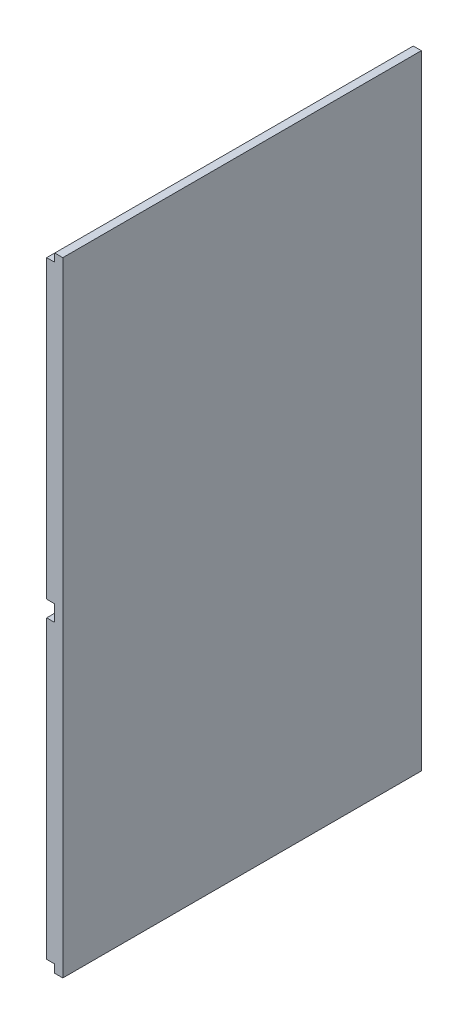
ISO-10303-21;
HEADER;
FILE_DESCRIPTION(('STEP AP214'),'2;1');
FILE_NAME('part.step','',(''),(''),'','','');
FILE_SCHEMA(('AUTOMOTIVE_DESIGN { 1 0 10303 214 1 1 1 1 }'));
ENDSEC;
DATA;
#1=APPLICATION_CONTEXT('core data for automotive mechanical design processes');
#2=APPLICATION_PROTOCOL_DEFINITION('international standard','automotive_design',2000,#1);
#3=PRODUCT_CONTEXT('',#1,'mechanical');
#4=PRODUCT('Part','Part','',(#3));
#5=PRODUCT_RELATED_PRODUCT_CATEGORY('part','',(#4));
#6=PRODUCT_DEFINITION_FORMATION('','',#4);
#7=PRODUCT_DEFINITION_CONTEXT('part definition',#1,'design');
#8=PRODUCT_DEFINITION('design','',#6,#7);
#9=PRODUCT_DEFINITION_SHAPE('','',#8);
#10=(LENGTH_UNIT() NAMED_UNIT(*) SI_UNIT(.MILLI.,.METRE.));
#11=(NAMED_UNIT(*) PLANE_ANGLE_UNIT() SI_UNIT($,.RADIAN.));
#12=(NAMED_UNIT(*) SI_UNIT($,.STERADIAN.) SOLID_ANGLE_UNIT());
#13=UNCERTAINTY_MEASURE_WITH_UNIT(LENGTH_MEASURE(1.E-05),#10,'distance_accuracy_value','');
#14=(GEOMETRIC_REPRESENTATION_CONTEXT(3) GLOBAL_UNCERTAINTY_ASSIGNED_CONTEXT((#13)) GLOBAL_UNIT_ASSIGNED_CONTEXT((#10,
#11,#12)) REPRESENTATION_CONTEXT('',''));
#15=CARTESIAN_POINT('',(0.,0.,0.));
#16=DIRECTION('',(0.,0.,1.));
#17=DIRECTION('',(1.,0.,0.));
#18=AXIS2_PLACEMENT_3D('',#15,#16,#17);
#19=CARTESIAN_POINT('',(0.,0.,0.));
#20=DIRECTION('',(-1.,0.,0.));
#21=DIRECTION('',(0.,0.,1.));
#22=AXIS2_PLACEMENT_3D('',#19,#20,#21);
#23=PLANE('',#22);
#24=DIRECTION('',(0.,0.,1.));
#25=VECTOR('',#24,1.);
#26=CARTESIAN_POINT('',(0.,-9.,-200.));
#27=LINE('',#26,#25);
#28=CARTESIAN_POINT('',(0.,-9.,-200.));
#29=VERTEX_POINT('',#28);
#30=CARTESIAN_POINT('',(0.,-9.,200.));
#31=VERTEX_POINT('',#30);
#32=EDGE_CURVE('E137',#29,#31,#27,.T.);
#33=ORIENTED_EDGE('',*,*,#32,.F.);
#34=DIRECTION('',(0.,1.,0.));
#35=VECTOR('',#34,1.);
#36=CARTESIAN_POINT('',(0.,-348.,-200.));
#37=LINE('',#36,#35);
#38=CARTESIAN_POINT('',(0.,-339.,-200.));
#39=VERTEX_POINT('',#38);
#40=EDGE_CURVE('E194',#39,#29,#37,.T.);
#41=ORIENTED_EDGE('',*,*,#40,.F.);
#42=DIRECTION('',(0.,0.,-1.));
#43=VECTOR('',#42,1.);
#44=CARTESIAN_POINT('',(0.,-339.,-200.));
#45=LINE('',#44,#43);
#46=CARTESIAN_POINT('',(0.,-339.,200.));
#47=VERTEX_POINT('',#46);
#48=EDGE_CURVE('E153',#47,#39,#45,.T.);
#49=ORIENTED_EDGE('',*,*,#48,.F.);
#50=DIRECTION('',(0.,-1.,0.));
#51=VECTOR('',#50,1.);
#52=CARTESIAN_POINT('',(0.,-348.,200.));
#53=LINE('',#52,#51);
#54=EDGE_CURVE('E56',#31,#47,#53,.T.);
#55=ORIENTED_EDGE('',*,*,#54,.F.);
#56=EDGE_LOOP('',(#33,#41,#49,#55));
#57=FACE_BOUND('',#56,.T.);
#58=ADVANCED_FACE('F33',(#57),#23,.T.);
#59=CARTESIAN_POINT('',(18.,-348.,-200.));
#60=DIRECTION('',(0.,0.,1.));
#61=DIRECTION('',(1.,0.,0.));
#62=AXIS2_PLACEMENT_3D('',#59,#60,#61);
#63=PLANE('',#62);
#64=ORIENTED_EDGE('',*,*,#40,.T.);
#65=DIRECTION('',(-1.,0.,0.));
#66=VECTOR('',#65,1.);
#67=CARTESIAN_POINT('',(9.,-9.,-200.));
#68=LINE('',#67,#66);
#69=CARTESIAN_POINT('',(9.,-9.,-200.));
#70=VERTEX_POINT('',#69);
#71=EDGE_CURVE('E145',#70,#29,#68,.T.);
#72=ORIENTED_EDGE('',*,*,#71,.F.);
#73=DIRECTION('',(0.,-1.,0.));
#74=VECTOR('',#73,1.);
#75=CARTESIAN_POINT('',(9.,-9.,-200.));
#76=LINE('',#75,#74);
#77=CARTESIAN_POINT('',(9.,9.,-200.));
#78=VERTEX_POINT('',#77);
#79=EDGE_CURVE('E129',#78,#70,#76,.T.);
#80=ORIENTED_EDGE('',*,*,#79,.F.);
#81=DIRECTION('',(-1.,0.,0.));
#82=VECTOR('',#81,1.);
#83=CARTESIAN_POINT('',(9.,9.,-200.));
#84=LINE('',#83,#82);
#85=CARTESIAN_POINT('',(0.,9.,-200.));
#86=VERTEX_POINT('',#85);
#87=EDGE_CURVE('E126',#78,#86,#84,.T.);
#88=ORIENTED_EDGE('',*,*,#87,.T.);
#89=CARTESIAN_POINT('',(0.,339.,-200.));
#90=VERTEX_POINT('',#89);
#91=EDGE_CURVE('E166',#86,#90,#37,.T.);
#92=ORIENTED_EDGE('',*,*,#91,.T.);
#93=DIRECTION('',(-1.,0.,0.));
#94=VECTOR('',#93,1.);
#95=CARTESIAN_POINT('',(9.,339.,-200.));
#96=LINE('',#95,#94);
#97=CARTESIAN_POINT('',(9.,339.,-200.));
#98=VERTEX_POINT('',#97);
#99=EDGE_CURVE('E178',#98,#90,#96,.T.);
#100=ORIENTED_EDGE('',*,*,#99,.F.);
#101=DIRECTION('',(0.,-1.,0.));
#102=VECTOR('',#101,1.);
#103=CARTESIAN_POINT('',(9.,348.,-200.));
#104=LINE('',#103,#102);
#105=CARTESIAN_POINT('',(9.,348.,-200.));
#106=VERTEX_POINT('',#105);
#107=EDGE_CURVE('E173',#106,#98,#104,.T.);
#108=ORIENTED_EDGE('',*,*,#107,.F.);
#109=DIRECTION('',(-1.,0.,0.));
#110=VECTOR('',#109,1.);
#111=CARTESIAN_POINT('',(18.,348.,-200.));
#112=LINE('',#111,#110);
#113=CARTESIAN_POINT('',(18.,348.,-200.));
#114=VERTEX_POINT('',#113);
#115=EDGE_CURVE('E11',#114,#106,#112,.T.);
#116=ORIENTED_EDGE('',*,*,#115,.F.);
#117=DIRECTION('',(0.,1.,0.));
#118=VECTOR('',#117,1.);
#119=CARTESIAN_POINT('',(18.,-348.,-200.));
#120=LINE('',#119,#118);
#121=CARTESIAN_POINT('',(18.,-348.,-200.));
#122=VERTEX_POINT('',#121);
#123=EDGE_CURVE('E184',#122,#114,#120,.T.);
#124=ORIENTED_EDGE('',*,*,#123,.F.);
#125=DIRECTION('',(-1.,0.,0.));
#126=VECTOR('',#125,1.);
#127=CARTESIAN_POINT('',(18.,-348.,-200.));
#128=LINE('',#127,#126);
#129=CARTESIAN_POINT('',(9.,-348.,-200.));
#130=VERTEX_POINT('',#129);
#131=EDGE_CURVE('E193',#122,#130,#128,.T.);
#132=ORIENTED_EDGE('',*,*,#131,.T.);
#133=DIRECTION('',(0.,-1.,0.));
#134=VECTOR('',#133,1.);
#135=CARTESIAN_POINT('',(9.,-348.,-200.));
#136=LINE('',#135,#134);
#137=CARTESIAN_POINT('',(9.,-339.,-200.));
#138=VERTEX_POINT('',#137);
#139=EDGE_CURVE('E150',#138,#130,#136,.T.);
#140=ORIENTED_EDGE('',*,*,#139,.F.);
#141=DIRECTION('',(-1.,0.,0.));
#142=VECTOR('',#141,1.);
#143=CARTESIAN_POINT('',(9.,-339.,-200.));
#144=LINE('',#143,#142);
#145=EDGE_CURVE('E163',#138,#39,#144,.T.);
#146=ORIENTED_EDGE('',*,*,#145,.T.);
#147=EDGE_LOOP('',(#64,#72,#80,#88,#92,#100,#108,#116,#124,#132,#140,#146));
#148=FACE_BOUND('',#147,.T.);
#149=ADVANCED_FACE('F35',(#148),#63,.F.);
#150=CARTESIAN_POINT('',(18.,348.,200.));
#151=DIRECTION('',(0.,-1.,0.));
#152=DIRECTION('',(0.,0.,-1.));
#153=AXIS2_PLACEMENT_3D('',#150,#151,#152);
#154=PLANE('',#153);
#155=ORIENTED_EDGE('',*,*,#115,.T.);
#156=DIRECTION('',(0.,0.,-1.));
#157=VECTOR('',#156,1.);
#158=CARTESIAN_POINT('',(9.,348.,200.));
#159=LINE('',#158,#157);
#160=CARTESIAN_POINT('',(9.,348.,200.));
#161=VERTEX_POINT('',#160);
#162=EDGE_CURVE('E170',#161,#106,#159,.T.);
#163=ORIENTED_EDGE('',*,*,#162,.F.);
#164=DIRECTION('',(-1.,0.,0.));
#165=VECTOR('',#164,1.);
#166=CARTESIAN_POINT('',(18.,348.,200.));
#167=LINE('',#166,#165);
#168=CARTESIAN_POINT('',(18.,348.,200.));
#169=VERTEX_POINT('',#168);
#170=EDGE_CURVE('E41',#169,#161,#167,.T.);
#171=ORIENTED_EDGE('',*,*,#170,.F.);
#172=DIRECTION('',(0.,0.,1.));
#173=VECTOR('',#172,1.);
#174=CARTESIAN_POINT('',(18.,348.,200.));
#175=LINE('',#174,#173);
#176=EDGE_CURVE('E187',#114,#169,#175,.T.);
#177=ORIENTED_EDGE('',*,*,#176,.F.);
#178=EDGE_LOOP('',(#155,#163,#171,#177));
#179=FACE_BOUND('',#178,.T.);
#180=ADVANCED_FACE('F209',(#179),#154,.F.);
#181=CARTESIAN_POINT('',(18.,-348.,200.));
#182=DIRECTION('',(0.,0.,-1.));
#183=DIRECTION('',(-1.,0.,0.));
#184=AXIS2_PLACEMENT_3D('',#181,#182,#183);
#185=PLANE('',#184);
#186=DIRECTION('',(0.,1.,0.));
#187=VECTOR('',#186,1.);
#188=CARTESIAN_POINT('',(9.,-9.,200.));
#189=LINE('',#188,#187);
#190=CARTESIAN_POINT('',(9.,-9.,200.));
#191=VERTEX_POINT('',#190);
#192=CARTESIAN_POINT('',(9.,9.,200.));
#193=VERTEX_POINT('',#192);
#194=EDGE_CURVE('E130',#191,#193,#189,.T.);
#195=ORIENTED_EDGE('',*,*,#194,.F.);
#196=DIRECTION('',(-1.,0.,0.));
#197=VECTOR('',#196,1.);
#198=CARTESIAN_POINT('',(9.,-9.,200.));
#199=LINE('',#198,#197);
#200=EDGE_CURVE('E180',#191,#31,#199,.T.);
#201=ORIENTED_EDGE('',*,*,#200,.T.);
#202=ORIENTED_EDGE('',*,*,#54,.T.);
#203=DIRECTION('',(-1.,0.,0.));
#204=VECTOR('',#203,1.);
#205=CARTESIAN_POINT('',(9.,-339.,200.));
#206=LINE('',#205,#204);
#207=CARTESIAN_POINT('',(9.,-339.,200.));
#208=VERTEX_POINT('',#207);
#209=EDGE_CURVE('E160',#208,#47,#206,.T.);
#210=ORIENTED_EDGE('',*,*,#209,.F.);
#211=DIRECTION('',(0.,1.,0.));
#212=VECTOR('',#211,1.);
#213=CARTESIAN_POINT('',(9.,-348.,200.));
#214=LINE('',#213,#212);
#215=CARTESIAN_POINT('',(9.,-348.,200.));
#216=VERTEX_POINT('',#215);
#217=EDGE_CURVE('E155',#216,#208,#214,.T.);
#218=ORIENTED_EDGE('',*,*,#217,.F.);
#219=DIRECTION('',(-1.,0.,0.));
#220=VECTOR('',#219,1.);
#221=CARTESIAN_POINT('',(18.,-348.,200.));
#222=LINE('',#221,#220);
#223=CARTESIAN_POINT('',(18.,-348.,200.));
#224=VERTEX_POINT('',#223);
#225=EDGE_CURVE('E200',#224,#216,#222,.T.);
#226=ORIENTED_EDGE('',*,*,#225,.F.);
#227=DIRECTION('',(0.,-1.,0.));
#228=VECTOR('',#227,1.);
#229=CARTESIAN_POINT('',(18.,-348.,200.));
#230=LINE('',#229,#228);
#231=EDGE_CURVE('E189',#169,#224,#230,.T.);
#232=ORIENTED_EDGE('',*,*,#231,.F.);
#233=ORIENTED_EDGE('',*,*,#170,.T.);
#234=DIRECTION('',(0.,1.,0.));
#235=VECTOR('',#234,1.);
#236=CARTESIAN_POINT('',(9.,348.,200.));
#237=LINE('',#236,#235);
#238=CARTESIAN_POINT('',(9.,339.,200.));
#239=VERTEX_POINT('',#238);
#240=EDGE_CURVE('E168',#239,#161,#237,.T.);
#241=ORIENTED_EDGE('',*,*,#240,.F.);
#242=DIRECTION('',(-1.,0.,0.));
#243=VECTOR('',#242,1.);
#244=CARTESIAN_POINT('',(9.,339.,200.));
#245=LINE('',#244,#243);
#246=CARTESIAN_POINT('',(0.,339.,200.));
#247=VERTEX_POINT('',#246);
#248=EDGE_CURVE('E162',#239,#247,#245,.T.);
#249=ORIENTED_EDGE('',*,*,#248,.T.);
#250=CARTESIAN_POINT('',(0.,9.00000000000001,200.));
#251=VERTEX_POINT('',#250);
#252=EDGE_CURVE('E143',#247,#251,#53,.T.);
#253=ORIENTED_EDGE('',*,*,#252,.T.);
#254=DIRECTION('',(-1.,0.,0.));
#255=VECTOR('',#254,1.);
#256=CARTESIAN_POINT('',(9.,9.,200.));
#257=LINE('',#256,#255);
#258=EDGE_CURVE('E48',#193,#251,#257,.T.);
#259=ORIENTED_EDGE('',*,*,#258,.F.);
#260=EDGE_LOOP('',(#195,#201,#202,#210,#218,#226,#232,#233,#241,#249,#253,#259));
#261=FACE_BOUND('',#260,.T.);
#262=ADVANCED_FACE('F140',(#261),#185,.F.);
#263=CARTESIAN_POINT('',(18.,-348.,200.));
#264=DIRECTION('',(0.,1.,0.));
#265=DIRECTION('',(0.,0.,1.));
#266=AXIS2_PLACEMENT_3D('',#263,#264,#265);
#267=PLANE('',#266);
#268=ORIENTED_EDGE('',*,*,#225,.T.);
#269=DIRECTION('',(0.,0.,1.));
#270=VECTOR('',#269,1.);
#271=CARTESIAN_POINT('',(9.,-348.,-200.));
#272=LINE('',#271,#270);
#273=EDGE_CURVE('E152',#130,#216,#272,.T.);
#274=ORIENTED_EDGE('',*,*,#273,.F.);
#275=ORIENTED_EDGE('',*,*,#131,.F.);
#276=DIRECTION('',(0.,0.,-1.));
#277=VECTOR('',#276,1.);
#278=CARTESIAN_POINT('',(18.,-348.,200.));
#279=LINE('',#278,#277);
#280=EDGE_CURVE('E191',#224,#122,#279,.T.);
#281=ORIENTED_EDGE('',*,*,#280,.F.);
#282=EDGE_LOOP('',(#268,#274,#275,#281));
#283=FACE_BOUND('',#282,.T.);
#284=ADVANCED_FACE('F246',(#283),#267,.F.);
#285=CARTESIAN_POINT('',(18.,0.,0.));
#286=DIRECTION('',(-1.,0.,0.));
#287=DIRECTION('',(0.,0.,1.));
#288=AXIS2_PLACEMENT_3D('',#285,#286,#287);
#289=PLANE('',#288);
#290=ORIENTED_EDGE('',*,*,#123,.T.);
#291=ORIENTED_EDGE('',*,*,#176,.T.);
#292=ORIENTED_EDGE('',*,*,#231,.T.);
#293=ORIENTED_EDGE('',*,*,#280,.T.);
#294=EDGE_LOOP('',(#290,#291,#292,#293));
#295=FACE_BOUND('',#294,.T.);
#296=ADVANCED_FACE('F249',(#295),#289,.F.);
#297=DIRECTION('',(0.,0.,-1.));
#298=VECTOR('',#297,1.);
#299=CARTESIAN_POINT('',(0.,9.,-200.));
#300=LINE('',#299,#298);
#301=EDGE_CURVE('E224',#251,#86,#300,.T.);
#302=ORIENTED_EDGE('',*,*,#301,.F.);
#303=ORIENTED_EDGE('',*,*,#252,.F.);
#304=DIRECTION('',(0.,0.,1.));
#305=VECTOR('',#304,1.);
#306=CARTESIAN_POINT('',(0.,339.,200.));
#307=LINE('',#306,#305);
#308=EDGE_CURVE('E171',#90,#247,#307,.T.);
#309=ORIENTED_EDGE('',*,*,#308,.F.);
#310=ORIENTED_EDGE('',*,*,#91,.F.);
#311=EDGE_LOOP('',(#302,#303,#309,#310));
#312=FACE_BOUND('',#311,.T.);
#313=ADVANCED_FACE('F223',(#312),#23,.T.);
#314=CARTESIAN_POINT('',(9.,339.,200.));
#315=DIRECTION('',(0.,-1.,0.));
#316=DIRECTION('',(0.,0.,-1.));
#317=AXIS2_PLACEMENT_3D('',#314,#315,#316);
#318=PLANE('',#317);
#319=ORIENTED_EDGE('',*,*,#308,.T.);
#320=ORIENTED_EDGE('',*,*,#248,.F.);
#321=DIRECTION('',(0.,0.,1.));
#322=VECTOR('',#321,1.);
#323=CARTESIAN_POINT('',(9.,339.,200.));
#324=LINE('',#323,#322);
#325=EDGE_CURVE('E175',#98,#239,#324,.T.);
#326=ORIENTED_EDGE('',*,*,#325,.F.);
#327=ORIENTED_EDGE('',*,*,#99,.T.);
#328=EDGE_LOOP('',(#319,#320,#326,#327));
#329=FACE_BOUND('',#328,.T.);
#330=ADVANCED_FACE('F221',(#329),#318,.F.);
#331=CARTESIAN_POINT('',(9.,0.,0.));
#332=DIRECTION('',(1.,0.,0.));
#333=DIRECTION('',(0.,0.,-1.));
#334=AXIS2_PLACEMENT_3D('',#331,#332,#333);
#335=PLANE('',#334);
#336=ORIENTED_EDGE('',*,*,#240,.T.);
#337=ORIENTED_EDGE('',*,*,#162,.T.);
#338=ORIENTED_EDGE('',*,*,#107,.T.);
#339=ORIENTED_EDGE('',*,*,#325,.T.);
#340=EDGE_LOOP('',(#336,#337,#338,#339));
#341=FACE_BOUND('',#340,.T.);
#342=ADVANCED_FACE('F213',(#341),#335,.F.);
#343=CARTESIAN_POINT('',(9.,-339.,-200.));
#344=DIRECTION('',(0.,1.,0.));
#345=DIRECTION('',(0.,0.,1.));
#346=AXIS2_PLACEMENT_3D('',#343,#344,#345);
#347=PLANE('',#346);
#348=ORIENTED_EDGE('',*,*,#48,.T.);
#349=ORIENTED_EDGE('',*,*,#145,.F.);
#350=DIRECTION('',(0.,0.,-1.));
#351=VECTOR('',#350,1.);
#352=CARTESIAN_POINT('',(9.,-339.,-200.));
#353=LINE('',#352,#351);
#354=EDGE_CURVE('E157',#208,#138,#353,.T.);
#355=ORIENTED_EDGE('',*,*,#354,.F.);
#356=ORIENTED_EDGE('',*,*,#209,.T.);
#357=EDGE_LOOP('',(#348,#349,#355,#356));
#358=FACE_BOUND('',#357,.T.);
#359=ADVANCED_FACE('F239',(#358),#347,.F.);
#360=CARTESIAN_POINT('',(9.,0.,0.));
#361=DIRECTION('',(1.,0.,0.));
#362=DIRECTION('',(0.,0.,-1.));
#363=AXIS2_PLACEMENT_3D('',#360,#361,#362);
#364=PLANE('',#363);
#365=ORIENTED_EDGE('',*,*,#139,.T.);
#366=ORIENTED_EDGE('',*,*,#273,.T.);
#367=ORIENTED_EDGE('',*,*,#217,.T.);
#368=ORIENTED_EDGE('',*,*,#354,.T.);
#369=EDGE_LOOP('',(#365,#366,#367,#368));
#370=FACE_BOUND('',#369,.T.);
#371=ADVANCED_FACE('F241',(#370),#364,.F.);
#372=CARTESIAN_POINT('',(9.,-9.,-200.));
#373=DIRECTION('',(0.,-1.,0.));
#374=DIRECTION('',(0.,0.,-1.));
#375=AXIS2_PLACEMENT_3D('',#372,#373,#374);
#376=PLANE('',#375);
#377=ORIENTED_EDGE('',*,*,#32,.T.);
#378=ORIENTED_EDGE('',*,*,#200,.F.);
#379=DIRECTION('',(0.,0.,1.));
#380=VECTOR('',#379,1.);
#381=CARTESIAN_POINT('',(9.,-9.,-200.));
#382=LINE('',#381,#380);
#383=EDGE_CURVE('E136',#70,#191,#382,.T.);
#384=ORIENTED_EDGE('',*,*,#383,.F.);
#385=ORIENTED_EDGE('',*,*,#71,.T.);
#386=EDGE_LOOP('',(#377,#378,#384,#385));
#387=FACE_BOUND('',#386,.T.);
#388=ADVANCED_FACE('F232',(#387),#376,.F.);
#389=CARTESIAN_POINT('',(9.,9.,-200.));
#390=DIRECTION('',(0.,1.,0.));
#391=DIRECTION('',(0.,0.,1.));
#392=AXIS2_PLACEMENT_3D('',#389,#390,#391);
#393=PLANE('',#392);
#394=ORIENTED_EDGE('',*,*,#301,.T.);
#395=ORIENTED_EDGE('',*,*,#87,.F.);
#396=DIRECTION('',(0.,0.,-1.));
#397=VECTOR('',#396,1.);
#398=CARTESIAN_POINT('',(9.,9.,-200.));
#399=LINE('',#398,#397);
#400=EDGE_CURVE('E122',#193,#78,#399,.T.);
#401=ORIENTED_EDGE('',*,*,#400,.F.);
#402=ORIENTED_EDGE('',*,*,#258,.T.);
#403=EDGE_LOOP('',(#394,#395,#401,#402));
#404=FACE_BOUND('',#403,.T.);
#405=ADVANCED_FACE('F124',(#404),#393,.F.);
#406=CARTESIAN_POINT('',(9.,0.,0.));
#407=DIRECTION('',(1.,0.,0.));
#408=DIRECTION('',(0.,0.,-1.));
#409=AXIS2_PLACEMENT_3D('',#406,#407,#408);
#410=PLANE('',#409);
#411=ORIENTED_EDGE('',*,*,#194,.T.);
#412=ORIENTED_EDGE('',*,*,#400,.T.);
#413=ORIENTED_EDGE('',*,*,#79,.T.);
#414=ORIENTED_EDGE('',*,*,#383,.T.);
#415=EDGE_LOOP('',(#411,#412,#413,#414));
#416=FACE_BOUND('',#415,.T.);
#417=ADVANCED_FACE('F134',(#416),#410,.F.);
#418=CLOSED_SHELL('',(#58,#149,#180,#262,#284,#296,#313,#330,#342,#359,#371,#388,#405,#417));
#419=MANIFOLD_SOLID_BREP('B2',#418);
#420=ADVANCED_BREP_SHAPE_REPRESENTATION('',(#18,#419),#14);
#421=SHAPE_DEFINITION_REPRESENTATION(#9,#420);
ENDSEC;
END-ISO-10303-21;
